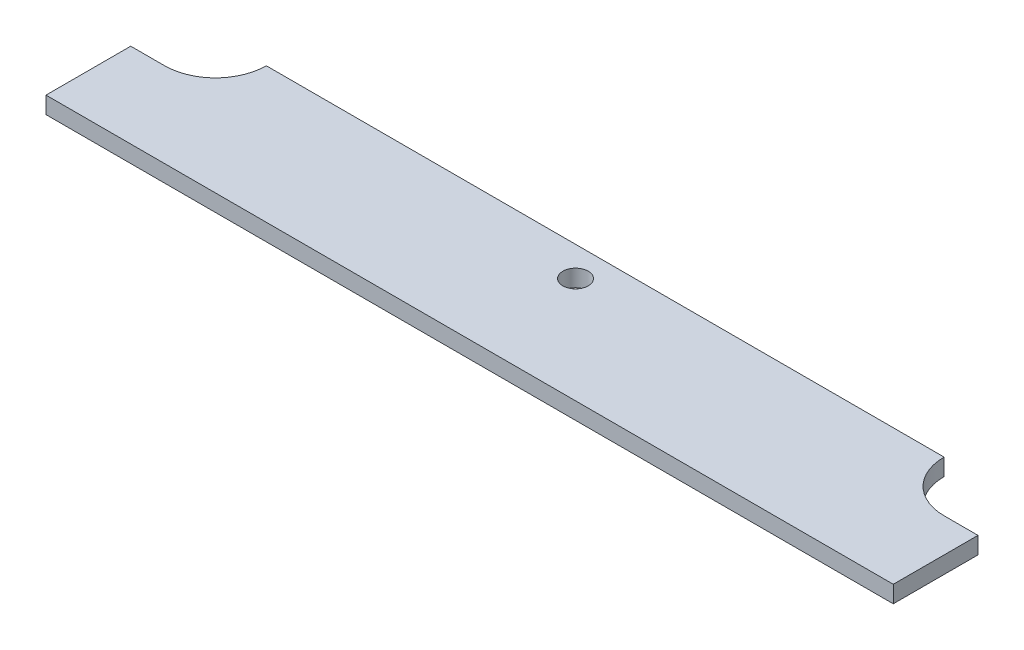
ISO-10303-21;
HEADER;
FILE_DESCRIPTION(('STEP AP214'),'2;1');
FILE_NAME('part.step','',(''),(''),'','','');
FILE_SCHEMA(('AUTOMOTIVE_DESIGN { 1 0 10303 214 1 1 1 1 }'));
ENDSEC;
DATA;
#1=APPLICATION_CONTEXT('core data for automotive mechanical design processes');
#2=APPLICATION_PROTOCOL_DEFINITION('international standard','automotive_design',2000,#1);
#3=PRODUCT_CONTEXT('',#1,'mechanical');
#4=PRODUCT('Part','Part','',(#3));
#5=PRODUCT_RELATED_PRODUCT_CATEGORY('part','',(#4));
#6=PRODUCT_DEFINITION_FORMATION('','',#4);
#7=PRODUCT_DEFINITION_CONTEXT('part definition',#1,'design');
#8=PRODUCT_DEFINITION('design','',#6,#7);
#9=PRODUCT_DEFINITION_SHAPE('','',#8);
#10=(LENGTH_UNIT() NAMED_UNIT(*) SI_UNIT(.MILLI.,.METRE.));
#11=(NAMED_UNIT(*) PLANE_ANGLE_UNIT() SI_UNIT($,.RADIAN.));
#12=(NAMED_UNIT(*) SI_UNIT($,.STERADIAN.) SOLID_ANGLE_UNIT());
#13=UNCERTAINTY_MEASURE_WITH_UNIT(LENGTH_MEASURE(1.E-05),#10,'distance_accuracy_value','');
#14=(GEOMETRIC_REPRESENTATION_CONTEXT(3) GLOBAL_UNCERTAINTY_ASSIGNED_CONTEXT((#13)) GLOBAL_UNIT_ASSIGNED_CONTEXT((#10,
#11,#12)) REPRESENTATION_CONTEXT('',''));
#15=CARTESIAN_POINT('',(0.,0.,0.));
#16=DIRECTION('',(0.,0.,1.));
#17=DIRECTION('',(1.,0.,0.));
#18=AXIS2_PLACEMENT_3D('',#15,#16,#17);
#19=CARTESIAN_POINT('',(317.5,12.7,-50.8));
#20=DIRECTION('',(-1.,0.,0.));
#21=DIRECTION('',(0.,0.,1.));
#22=AXIS2_PLACEMENT_3D('',#19,#20,#21);
#23=PLANE('',#22);
#24=DIRECTION('',(0.,1.,0.));
#25=VECTOR('',#24,1.);
#26=CARTESIAN_POINT('',(317.5,0.,-12.7));
#27=LINE('',#26,#25);
#28=CARTESIAN_POINT('',(317.5,0.,-12.7));
#29=VERTEX_POINT('',#28);
#30=CARTESIAN_POINT('',(317.5,12.7,-12.7));
#31=VERTEX_POINT('',#30);
#32=EDGE_CURVE('E47',#29,#31,#27,.T.);
#33=ORIENTED_EDGE('',*,*,#32,.T.);
#34=DIRECTION('',(0.,0.,-1.));
#35=VECTOR('',#34,1.);
#36=CARTESIAN_POINT('',(317.5,12.7,-50.8));
#37=LINE('',#36,#35);
#38=CARTESIAN_POINT('',(317.5,12.7,50.8));
#39=VERTEX_POINT('',#38);
#40=EDGE_CURVE('E146',#39,#31,#37,.T.);
#41=ORIENTED_EDGE('',*,*,#40,.F.);
#42=DIRECTION('',(0.,-1.,0.));
#43=VECTOR('',#42,1.);
#44=CARTESIAN_POINT('',(317.5,12.7,50.8));
#45=LINE('',#44,#43);
#46=CARTESIAN_POINT('',(317.5,0.,50.8));
#47=VERTEX_POINT('',#46);
#48=EDGE_CURVE('E40',#39,#47,#45,.T.);
#49=ORIENTED_EDGE('',*,*,#48,.T.);
#50=DIRECTION('',(0.,0.,-1.));
#51=VECTOR('',#50,1.);
#52=CARTESIAN_POINT('',(317.5,0.,-50.8));
#53=LINE('',#52,#51);
#54=EDGE_CURVE('E141',#47,#29,#53,.T.);
#55=ORIENTED_EDGE('',*,*,#54,.T.);
#56=EDGE_LOOP('',(#33,#41,#49,#55));
#57=FACE_BOUND('',#56,.T.);
#58=ADVANCED_FACE('F33',(#57),#23,.F.);
#59=CARTESIAN_POINT('',(-317.5,12.7,-50.8));
#60=DIRECTION('',(0.,0.,1.));
#61=DIRECTION('',(1.,0.,0.));
#62=AXIS2_PLACEMENT_3D('',#59,#60,#61);
#63=PLANE('',#62);
#64=DIRECTION('',(0.,1.,0.));
#65=VECTOR('',#64,1.);
#66=CARTESIAN_POINT('',(254.,0.,-50.8));
#67=LINE('',#66,#65);
#68=CARTESIAN_POINT('',(254.,0.,-50.8));
#69=VERTEX_POINT('',#68);
#70=CARTESIAN_POINT('',(254.,12.7,-50.8));
#71=VERTEX_POINT('',#70);
#72=EDGE_CURVE('E125',#69,#71,#67,.T.);
#73=ORIENTED_EDGE('',*,*,#72,.F.);
#74=DIRECTION('',(-1.,0.,0.));
#75=VECTOR('',#74,1.);
#76=CARTESIAN_POINT('',(-317.5,0.,-50.8));
#77=LINE('',#76,#75);
#78=CARTESIAN_POINT('',(-254.,0.,-50.8));
#79=VERTEX_POINT('',#78);
#80=EDGE_CURVE('E115',#69,#79,#77,.T.);
#81=ORIENTED_EDGE('',*,*,#80,.T.);
#82=DIRECTION('',(0.,1.,0.));
#83=VECTOR('',#82,1.);
#84=CARTESIAN_POINT('',(-254.,0.,-50.8));
#85=LINE('',#84,#83);
#86=CARTESIAN_POINT('',(-254.,12.7,-50.8));
#87=VERTEX_POINT('',#86);
#88=EDGE_CURVE('E134',#79,#87,#85,.T.);
#89=ORIENTED_EDGE('',*,*,#88,.T.);
#90=DIRECTION('',(-1.,0.,0.));
#91=VECTOR('',#90,1.);
#92=CARTESIAN_POINT('',(-317.5,12.7,-50.8));
#93=LINE('',#92,#91);
#94=EDGE_CURVE('E149',#71,#87,#93,.T.);
#95=ORIENTED_EDGE('',*,*,#94,.F.);
#96=EDGE_LOOP('',(#73,#81,#89,#95));
#97=FACE_BOUND('',#96,.T.);
#98=ADVANCED_FACE('F183',(#97),#63,.F.);
#99=CARTESIAN_POINT('',(0.,12.7,0.));
#100=DIRECTION('',(0.,1.,0.));
#101=DIRECTION('',(0.,0.,1.));
#102=AXIS2_PLACEMENT_3D('',#99,#100,#101);
#103=PLANE('',#102);
#104=CARTESIAN_POINT('',(0.,12.7,-28.575));
#105=DIRECTION('',(0.,1.,0.));
#106=DIRECTION('',(0.,0.,1.));
#107=AXIS2_PLACEMENT_3D('',#104,#105,#106);
#108=CIRCLE('',#107,9.525);
#109=CARTESIAN_POINT('',(0.,12.7,-19.05));
#110=VERTEX_POINT('',#109);
#111=EDGE_CURVE('E120',#110,#110,#108,.T.);
#112=ORIENTED_EDGE('',*,*,#111,.F.);
#113=EDGE_LOOP('',(#112));
#114=FACE_BOUND('',#113,.T.);
#115=DIRECTION('',(-1.,0.,0.));
#116=VECTOR('',#115,1.);
#117=CARTESIAN_POINT('',(292.1,12.7,-12.7));
#118=LINE('',#117,#116);
#119=CARTESIAN_POINT('',(292.1,12.7,-12.7));
#120=VERTEX_POINT('',#119);
#121=EDGE_CURVE('E116',#31,#120,#118,.T.);
#122=ORIENTED_EDGE('',*,*,#121,.T.);
#123=CARTESIAN_POINT('',(292.1,12.7,-50.8));
#124=DIRECTION('',(0.,-1.,0.));
#125=DIRECTION('',(0.,0.,-1.));
#126=AXIS2_PLACEMENT_3D('',#123,#124,#125);
#127=CIRCLE('',#126,38.1);
#128=EDGE_CURVE('E110',#120,#71,#127,.T.);
#129=ORIENTED_EDGE('',*,*,#128,.T.);
#130=ORIENTED_EDGE('',*,*,#94,.T.);
#131=CARTESIAN_POINT('',(-292.1,12.7,-50.8));
#132=DIRECTION('',(0.,1.,0.));
#133=DIRECTION('',(0.,0.,-1.));
#134=AXIS2_PLACEMENT_3D('',#131,#132,#133);
#135=CIRCLE('',#134,38.1);
#136=CARTESIAN_POINT('',(-292.1,12.7,-12.7));
#137=VERTEX_POINT('',#136);
#138=EDGE_CURVE('E127',#137,#87,#135,.T.);
#139=ORIENTED_EDGE('',*,*,#138,.F.);
#140=DIRECTION('',(1.,0.,0.));
#141=VECTOR('',#140,1.);
#142=CARTESIAN_POINT('',(-292.1,12.7,-12.7));
#143=LINE('',#142,#141);
#144=CARTESIAN_POINT('',(-317.5,12.7,-12.7));
#145=VERTEX_POINT('',#144);
#146=EDGE_CURVE('E131',#145,#137,#143,.T.);
#147=ORIENTED_EDGE('',*,*,#146,.F.);
#148=DIRECTION('',(0.,0.,1.));
#149=VECTOR('',#148,1.);
#150=CARTESIAN_POINT('',(-317.5,12.7,-50.8));
#151=LINE('',#150,#149);
#152=CARTESIAN_POINT('',(-317.5,12.7,50.8));
#153=VERTEX_POINT('',#152);
#154=EDGE_CURVE('E152',#145,#153,#151,.T.);
#155=ORIENTED_EDGE('',*,*,#154,.T.);
#156=DIRECTION('',(1.,0.,0.));
#157=VECTOR('',#156,1.);
#158=CARTESIAN_POINT('',(-317.5,12.7,50.8));
#159=LINE('',#158,#157);
#160=EDGE_CURVE('E154',#153,#39,#159,.T.);
#161=ORIENTED_EDGE('',*,*,#160,.T.);
#162=ORIENTED_EDGE('',*,*,#40,.T.);
#163=EDGE_LOOP('',(#122,#129,#130,#139,#147,#155,#161,#162));
#164=FACE_BOUND('',#163,.T.);
#165=ADVANCED_FACE('F179',(#114,#164),#103,.T.);
#166=CARTESIAN_POINT('',(0.,0.,0.));
#167=DIRECTION('',(0.,1.,0.));
#168=DIRECTION('',(0.,0.,1.));
#169=AXIS2_PLACEMENT_3D('',#166,#167,#168);
#170=PLANE('',#169);
#171=CARTESIAN_POINT('',(0.,0.,-28.575));
#172=DIRECTION('',(0.,1.,0.));
#173=DIRECTION('',(0.,0.,1.));
#174=AXIS2_PLACEMENT_3D('',#171,#172,#173);
#175=CIRCLE('',#174,9.525);
#176=CARTESIAN_POINT('',(0.,0.,-19.05));
#177=VERTEX_POINT('',#176);
#178=EDGE_CURVE('E123',#177,#177,#175,.T.);
#179=ORIENTED_EDGE('',*,*,#178,.T.);
#180=EDGE_LOOP('',(#179));
#181=FACE_BOUND('',#180,.T.);
#182=CARTESIAN_POINT('',(292.1,0.,-50.8));
#183=DIRECTION('',(0.,-1.,0.));
#184=DIRECTION('',(0.,0.,-1.));
#185=AXIS2_PLACEMENT_3D('',#182,#183,#184);
#186=CIRCLE('',#185,38.1);
#187=CARTESIAN_POINT('',(292.1,0.,-12.7));
#188=VERTEX_POINT('',#187);
#189=EDGE_CURVE('E104',#188,#69,#186,.T.);
#190=ORIENTED_EDGE('',*,*,#189,.F.);
#191=DIRECTION('',(-1.,0.,0.));
#192=VECTOR('',#191,1.);
#193=CARTESIAN_POINT('',(292.1,0.,-12.7));
#194=LINE('',#193,#192);
#195=EDGE_CURVE('E95',#29,#188,#194,.T.);
#196=ORIENTED_EDGE('',*,*,#195,.F.);
#197=ORIENTED_EDGE('',*,*,#54,.F.);
#198=DIRECTION('',(1.,0.,0.));
#199=VECTOR('',#198,1.);
#200=CARTESIAN_POINT('',(-317.5,0.,50.8));
#201=LINE('',#200,#199);
#202=CARTESIAN_POINT('',(-317.5,0.,50.8));
#203=VERTEX_POINT('',#202);
#204=EDGE_CURVE('E150',#203,#47,#201,.T.);
#205=ORIENTED_EDGE('',*,*,#204,.F.);
#206=DIRECTION('',(0.,0.,1.));
#207=VECTOR('',#206,1.);
#208=CARTESIAN_POINT('',(-317.5,0.,-50.8));
#209=LINE('',#208,#207);
#210=CARTESIAN_POINT('',(-317.5,0.,-12.7));
#211=VERTEX_POINT('',#210);
#212=EDGE_CURVE('E158',#211,#203,#209,.T.);
#213=ORIENTED_EDGE('',*,*,#212,.F.);
#214=DIRECTION('',(1.,0.,0.));
#215=VECTOR('',#214,1.);
#216=CARTESIAN_POINT('',(-292.1,0.,-12.7));
#217=LINE('',#216,#215);
#218=CARTESIAN_POINT('',(-292.1,0.,-12.7));
#219=VERTEX_POINT('',#218);
#220=EDGE_CURVE('E130',#211,#219,#217,.T.);
#221=ORIENTED_EDGE('',*,*,#220,.T.);
#222=CARTESIAN_POINT('',(-292.1,0.,-50.8));
#223=DIRECTION('',(0.,1.,0.));
#224=DIRECTION('',(0.,0.,-1.));
#225=AXIS2_PLACEMENT_3D('',#222,#223,#224);
#226=CIRCLE('',#225,38.1);
#227=EDGE_CURVE('E55',#219,#79,#226,.T.);
#228=ORIENTED_EDGE('',*,*,#227,.T.);
#229=ORIENTED_EDGE('',*,*,#80,.F.);
#230=EDGE_LOOP('',(#190,#196,#197,#205,#213,#221,#228,#229));
#231=FACE_BOUND('',#230,.T.);
#232=ADVANCED_FACE('F114',(#181,#231),#170,.F.);
#233=CARTESIAN_POINT('',(-317.5,12.7,-50.8));
#234=DIRECTION('',(1.,0.,0.));
#235=DIRECTION('',(0.,0.,-1.));
#236=AXIS2_PLACEMENT_3D('',#233,#234,#235);
#237=PLANE('',#236);
#238=ORIENTED_EDGE('',*,*,#154,.F.);
#239=DIRECTION('',(0.,1.,0.));
#240=VECTOR('',#239,1.);
#241=CARTESIAN_POINT('',(-317.5,0.,-12.7));
#242=LINE('',#241,#240);
#243=EDGE_CURVE('E142',#211,#145,#242,.T.);
#244=ORIENTED_EDGE('',*,*,#243,.F.);
#245=ORIENTED_EDGE('',*,*,#212,.T.);
#246=DIRECTION('',(0.,-1.,0.));
#247=VECTOR('',#246,1.);
#248=CARTESIAN_POINT('',(-317.5,12.7,50.8));
#249=LINE('',#248,#247);
#250=EDGE_CURVE('E11',#153,#203,#249,.T.);
#251=ORIENTED_EDGE('',*,*,#250,.F.);
#252=EDGE_LOOP('',(#238,#244,#245,#251));
#253=FACE_BOUND('',#252,.T.);
#254=ADVANCED_FACE('F172',(#253),#237,.F.);
#255=CARTESIAN_POINT('',(-317.5,12.7,50.8));
#256=DIRECTION('',(0.,0.,-1.));
#257=DIRECTION('',(-1.,0.,0.));
#258=AXIS2_PLACEMENT_3D('',#255,#256,#257);
#259=PLANE('',#258);
#260=ORIENTED_EDGE('',*,*,#204,.T.);
#261=ORIENTED_EDGE('',*,*,#48,.F.);
#262=ORIENTED_EDGE('',*,*,#160,.F.);
#263=ORIENTED_EDGE('',*,*,#250,.T.);
#264=EDGE_LOOP('',(#260,#261,#262,#263));
#265=FACE_BOUND('',#264,.T.);
#266=ADVANCED_FACE('F168',(#265),#259,.F.);
#267=CARTESIAN_POINT('',(-292.1,0.,-50.8));
#268=DIRECTION('',(0.,1.,0.));
#269=DIRECTION('',(0.,0.,1.));
#270=AXIS2_PLACEMENT_3D('',#267,#268,#269);
#271=CYLINDRICAL_SURFACE('',#270,38.1);
#272=ORIENTED_EDGE('',*,*,#138,.T.);
#273=ORIENTED_EDGE('',*,*,#88,.F.);
#274=ORIENTED_EDGE('',*,*,#227,.F.);
#275=DIRECTION('',(0.,1.,0.));
#276=VECTOR('',#275,1.);
#277=CARTESIAN_POINT('',(-292.1,0.,-12.7));
#278=LINE('',#277,#276);
#279=EDGE_CURVE('E139',#219,#137,#278,.T.);
#280=ORIENTED_EDGE('',*,*,#279,.T.);
#281=EDGE_LOOP('',(#272,#273,#274,#280));
#282=FACE_BOUND('',#281,.T.);
#283=ADVANCED_FACE('F181',(#282),#271,.F.);
#284=CARTESIAN_POINT('',(-292.1,0.,-12.7));
#285=DIRECTION('',(0.,0.,1.));
#286=DIRECTION('',(1.,0.,0.));
#287=AXIS2_PLACEMENT_3D('',#284,#285,#286);
#288=PLANE('',#287);
#289=ORIENTED_EDGE('',*,*,#146,.T.);
#290=ORIENTED_EDGE('',*,*,#279,.F.);
#291=ORIENTED_EDGE('',*,*,#220,.F.);
#292=ORIENTED_EDGE('',*,*,#243,.T.);
#293=EDGE_LOOP('',(#289,#290,#291,#292));
#294=FACE_BOUND('',#293,.T.);
#295=ADVANCED_FACE('F176',(#294),#288,.F.);
#296=CARTESIAN_POINT('',(292.1,0.,-50.8));
#297=DIRECTION('',(0.,1.,0.));
#298=DIRECTION('',(0.,0.,1.));
#299=AXIS2_PLACEMENT_3D('',#296,#297,#298);
#300=CYLINDRICAL_SURFACE('',#299,38.1);
#301=ORIENTED_EDGE('',*,*,#128,.F.);
#302=DIRECTION('',(0.,1.,0.));
#303=VECTOR('',#302,1.);
#304=CARTESIAN_POINT('',(292.1,0.,-12.7));
#305=LINE('',#304,#303);
#306=EDGE_CURVE('E98',#188,#120,#305,.T.);
#307=ORIENTED_EDGE('',*,*,#306,.F.);
#308=ORIENTED_EDGE('',*,*,#189,.T.);
#309=ORIENTED_EDGE('',*,*,#72,.T.);
#310=EDGE_LOOP('',(#301,#307,#308,#309));
#311=FACE_BOUND('',#310,.T.);
#312=ADVANCED_FACE('F107',(#311),#300,.F.);
#313=CARTESIAN_POINT('',(292.1,0.,-12.7));
#314=DIRECTION('',(0.,0.,-1.));
#315=DIRECTION('',(-1.,0.,0.));
#316=AXIS2_PLACEMENT_3D('',#313,#314,#315);
#317=PLANE('',#316);
#318=ORIENTED_EDGE('',*,*,#121,.F.);
#319=ORIENTED_EDGE('',*,*,#32,.F.);
#320=ORIENTED_EDGE('',*,*,#195,.T.);
#321=ORIENTED_EDGE('',*,*,#306,.T.);
#322=EDGE_LOOP('',(#318,#319,#320,#321));
#323=FACE_BOUND('',#322,.T.);
#324=ADVANCED_FACE('F97',(#323),#317,.T.);
#325=CARTESIAN_POINT('',(0.,0.,-28.575));
#326=DIRECTION('',(0.,1.,0.));
#327=DIRECTION('',(0.,0.,1.));
#328=AXIS2_PLACEMENT_3D('',#325,#326,#327);
#329=CYLINDRICAL_SURFACE('',#328,9.525);
#330=ORIENTED_EDGE('',*,*,#178,.F.);
#331=EDGE_LOOP('',(#330));
#332=FACE_BOUND('',#331,.T.);
#333=ORIENTED_EDGE('',*,*,#111,.T.);
#334=EDGE_LOOP('',(#333));
#335=FACE_BOUND('',#334,.T.);
#336=ADVANCED_FACE('F207',(#332,#335),#329,.F.);
#337=CLOSED_SHELL('',(#58,#98,#165,#232,#254,#266,#283,#295,#312,#324,#336));
#338=MANIFOLD_SOLID_BREP('B2',#337);
#339=ADVANCED_BREP_SHAPE_REPRESENTATION('',(#18,#338),#14);
#340=SHAPE_DEFINITION_REPRESENTATION(#9,#339);
ENDSEC;
END-ISO-10303-21;
